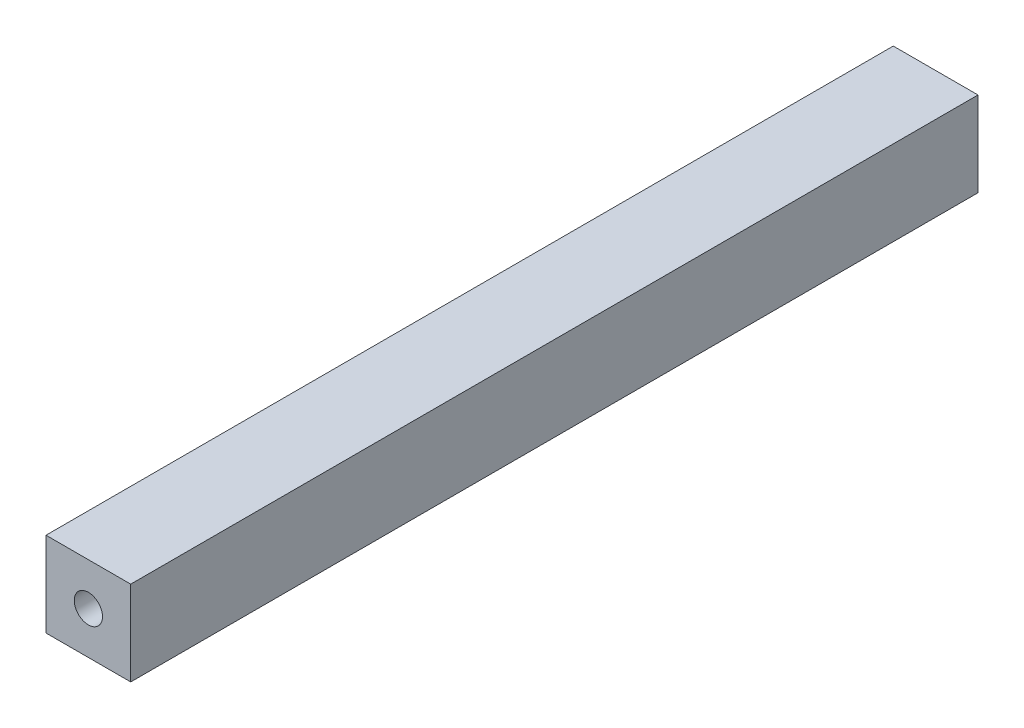
ISO-10303-21;
HEADER;
FILE_DESCRIPTION(('STEP AP214'),'2;1');
FILE_NAME('part.step','',(''),(''),'','','');
FILE_SCHEMA(('AUTOMOTIVE_DESIGN { 1 0 10303 214 1 1 1 1 }'));
ENDSEC;
DATA;
#1=APPLICATION_CONTEXT('core data for automotive mechanical design processes');
#2=APPLICATION_PROTOCOL_DEFINITION('international standard','automotive_design',2000,#1);
#3=PRODUCT_CONTEXT('',#1,'mechanical');
#4=PRODUCT('Part','Part','',(#3));
#5=PRODUCT_RELATED_PRODUCT_CATEGORY('part','',(#4));
#6=PRODUCT_DEFINITION_FORMATION('','',#4);
#7=PRODUCT_DEFINITION_CONTEXT('part definition',#1,'design');
#8=PRODUCT_DEFINITION('design','',#6,#7);
#9=PRODUCT_DEFINITION_SHAPE('','',#8);
#10=(LENGTH_UNIT() NAMED_UNIT(*) SI_UNIT(.MILLI.,.METRE.));
#11=(NAMED_UNIT(*) PLANE_ANGLE_UNIT() SI_UNIT($,.RADIAN.));
#12=(NAMED_UNIT(*) SI_UNIT($,.STERADIAN.) SOLID_ANGLE_UNIT());
#13=UNCERTAINTY_MEASURE_WITH_UNIT(LENGTH_MEASURE(1.E-05),#10,'distance_accuracy_value','');
#14=(GEOMETRIC_REPRESENTATION_CONTEXT(3) GLOBAL_UNCERTAINTY_ASSIGNED_CONTEXT((#13)) GLOBAL_UNIT_ASSIGNED_CONTEXT((#10,
#11,#12)) REPRESENTATION_CONTEXT('',''));
#15=CARTESIAN_POINT('',(0.,0.,0.));
#16=DIRECTION('',(0.,0.,1.));
#17=DIRECTION('',(1.,0.,0.));
#18=AXIS2_PLACEMENT_3D('',#15,#16,#17);
#19=CARTESIAN_POINT('',(-4.5,0.,90.));
#20=DIRECTION('',(-1.,0.,0.));
#21=DIRECTION('',(0.,0.,1.));
#22=AXIS2_PLACEMENT_3D('',#19,#20,#21);
#23=PLANE('',#22);
#24=DIRECTION('',(0.,1.,0.));
#25=VECTOR('',#24,1.);
#26=CARTESIAN_POINT('',(-4.5,0.,0.));
#27=LINE('',#26,#25);
#28=CARTESIAN_POINT('',(-4.5,-4.5,0.));
#29=VERTEX_POINT('',#28);
#30=CARTESIAN_POINT('',(-4.5,4.5,0.));
#31=VERTEX_POINT('',#30);
#32=EDGE_CURVE('E106',#29,#31,#27,.T.);
#33=ORIENTED_EDGE('',*,*,#32,.F.);
#34=DIRECTION('',(0.,0.,-1.));
#35=VECTOR('',#34,1.);
#36=CARTESIAN_POINT('',(-4.5,-4.5,90.));
#37=LINE('',#36,#35);
#38=CARTESIAN_POINT('',(-4.5,-4.5,90.));
#39=VERTEX_POINT('',#38);
#40=EDGE_CURVE('E11',#39,#29,#37,.T.);
#41=ORIENTED_EDGE('',*,*,#40,.F.);
#42=DIRECTION('',(0.,1.,0.));
#43=VECTOR('',#42,1.);
#44=CARTESIAN_POINT('',(-4.5,0.,90.));
#45=LINE('',#44,#43);
#46=CARTESIAN_POINT('',(-4.5,4.5,90.));
#47=VERTEX_POINT('',#46);
#48=EDGE_CURVE('E90',#39,#47,#45,.T.);
#49=ORIENTED_EDGE('',*,*,#48,.T.);
#50=DIRECTION('',(0.,0.,-1.));
#51=VECTOR('',#50,1.);
#52=CARTESIAN_POINT('',(-4.5,4.5,90.));
#53=LINE('',#52,#51);
#54=EDGE_CURVE('E52',#47,#31,#53,.T.);
#55=ORIENTED_EDGE('',*,*,#54,.T.);
#56=EDGE_LOOP('',(#33,#41,#49,#55));
#57=FACE_BOUND('',#56,.T.);
#58=ADVANCED_FACE('F35',(#57),#23,.T.);
#59=CARTESIAN_POINT('',(0.,-4.5,90.));
#60=DIRECTION('',(0.,1.,0.));
#61=DIRECTION('',(0.,0.,1.));
#62=AXIS2_PLACEMENT_3D('',#59,#60,#61);
#63=PLANE('',#62);
#64=DIRECTION('',(1.,0.,0.));
#65=VECTOR('',#64,1.);
#66=CARTESIAN_POINT('',(0.,-4.5,0.));
#67=LINE('',#66,#65);
#68=CARTESIAN_POINT('',(4.5,-4.5,0.));
#69=VERTEX_POINT('',#68);
#70=EDGE_CURVE('E95',#29,#69,#67,.T.);
#71=ORIENTED_EDGE('',*,*,#70,.T.);
#72=DIRECTION('',(0.,0.,-1.));
#73=VECTOR('',#72,1.);
#74=CARTESIAN_POINT('',(4.5,-4.5,90.));
#75=LINE('',#74,#73);
#76=CARTESIAN_POINT('',(4.5,-4.5,90.));
#77=VERTEX_POINT('',#76);
#78=EDGE_CURVE('E44',#77,#69,#75,.T.);
#79=ORIENTED_EDGE('',*,*,#78,.F.);
#80=DIRECTION('',(1.,0.,0.));
#81=VECTOR('',#80,1.);
#82=CARTESIAN_POINT('',(0.,-4.5,90.));
#83=LINE('',#82,#81);
#84=EDGE_CURVE('E86',#39,#77,#83,.T.);
#85=ORIENTED_EDGE('',*,*,#84,.F.);
#86=ORIENTED_EDGE('',*,*,#40,.T.);
#87=EDGE_LOOP('',(#71,#79,#85,#86));
#88=FACE_BOUND('',#87,.T.);
#89=ADVANCED_FACE('F93',(#88),#63,.F.);
#90=CARTESIAN_POINT('',(4.5,0.,90.));
#91=DIRECTION('',(-1.,0.,0.));
#92=DIRECTION('',(0.,0.,1.));
#93=AXIS2_PLACEMENT_3D('',#90,#91,#92);
#94=PLANE('',#93);
#95=DIRECTION('',(0.,1.,0.));
#96=VECTOR('',#95,1.);
#97=CARTESIAN_POINT('',(4.5,0.,0.));
#98=LINE('',#97,#96);
#99=CARTESIAN_POINT('',(4.5,4.5,0.));
#100=VERTEX_POINT('',#99);
#101=EDGE_CURVE('E103',#69,#100,#98,.T.);
#102=ORIENTED_EDGE('',*,*,#101,.T.);
#103=DIRECTION('',(0.,0.,-1.));
#104=VECTOR('',#103,1.);
#105=CARTESIAN_POINT('',(4.5,4.5,90.));
#106=LINE('',#105,#104);
#107=CARTESIAN_POINT('',(4.5,4.5,90.));
#108=VERTEX_POINT('',#107);
#109=EDGE_CURVE('E66',#108,#100,#106,.T.);
#110=ORIENTED_EDGE('',*,*,#109,.F.);
#111=DIRECTION('',(0.,1.,0.));
#112=VECTOR('',#111,1.);
#113=CARTESIAN_POINT('',(4.5,0.,90.));
#114=LINE('',#113,#112);
#115=EDGE_CURVE('E78',#77,#108,#114,.T.);
#116=ORIENTED_EDGE('',*,*,#115,.F.);
#117=ORIENTED_EDGE('',*,*,#78,.T.);
#118=EDGE_LOOP('',(#102,#110,#116,#117));
#119=FACE_BOUND('',#118,.T.);
#120=ADVANCED_FACE('F80',(#119),#94,.F.);
#121=CARTESIAN_POINT('',(0.,0.,90.));
#122=DIRECTION('',(0.,0.,-1.));
#123=DIRECTION('',(-1.,0.,0.));
#124=AXIS2_PLACEMENT_3D('',#121,#122,#123);
#125=CYLINDRICAL_SURFACE('',#124,1.5);
#126=CARTESIAN_POINT('',(0.,0.,90.));
#127=DIRECTION('',(0.,0.,1.));
#128=DIRECTION('',(1.,0.,0.));
#129=AXIS2_PLACEMENT_3D('',#126,#127,#128);
#130=CIRCLE('',#129,1.5);
#131=CARTESIAN_POINT('',(-1.5,0.,90.));
#132=VERTEX_POINT('',#131);
#133=EDGE_CURVE('E102',#132,#132,#130,.T.);
#134=CARTESIAN_POINT('',(0.,0.,0.));
#135=DIRECTION('',(0.,0.,1.));
#136=DIRECTION('',(1.,0.,0.));
#137=AXIS2_PLACEMENT_3D('',#134,#135,#136);
#138=CIRCLE('',#137,1.5);
#139=CARTESIAN_POINT('',(-1.5,0.,0.));
#140=VERTEX_POINT('',#139);
#141=EDGE_CURVE('E108',#140,#140,#138,.T.);
#142=CARTESIAN_POINT('',(-1.5,0.,90.));
#143=CARTESIAN_POINT('',(-1.5,0.,89.0625));
#144=CARTESIAN_POINT('',(-1.5,0.,88.125));
#145=CARTESIAN_POINT('',(-1.5,0.,86.25));
#146=CARTESIAN_POINT('',(-1.5,0.,85.3125));
#147=CARTESIAN_POINT('',(-1.5,0.,83.4375));
#148=CARTESIAN_POINT('',(-1.5,0.,82.5));
#149=CARTESIAN_POINT('',(-1.5,0.,80.625));
#150=CARTESIAN_POINT('',(-1.5,0.,79.6875));
#151=CARTESIAN_POINT('',(-1.5,0.,77.8125));
#152=CARTESIAN_POINT('',(-1.5,0.,76.875));
#153=CARTESIAN_POINT('',(-1.5,0.,75.));
#154=CARTESIAN_POINT('',(-1.5,0.,74.0625));
#155=CARTESIAN_POINT('',(-1.5,0.,72.1875));
#156=CARTESIAN_POINT('',(-1.5,0.,71.25));
#157=CARTESIAN_POINT('',(-1.5,0.,69.375));
#158=CARTESIAN_POINT('',(-1.5,0.,68.4375));
#159=CARTESIAN_POINT('',(-1.5,0.,66.5625));
#160=CARTESIAN_POINT('',(-1.5,0.,65.625));
#161=CARTESIAN_POINT('',(-1.5,0.,63.75));
#162=CARTESIAN_POINT('',(-1.5,0.,62.8125));
#163=CARTESIAN_POINT('',(-1.5,0.,60.9375));
#164=CARTESIAN_POINT('',(-1.5,0.,60.));
#165=CARTESIAN_POINT('',(-1.5,0.,58.125));
#166=CARTESIAN_POINT('',(-1.5,0.,57.1875));
#167=CARTESIAN_POINT('',(-1.5,0.,55.3125));
#168=CARTESIAN_POINT('',(-1.5,0.,54.375));
#169=CARTESIAN_POINT('',(-1.5,0.,52.5));
#170=CARTESIAN_POINT('',(-1.5,0.,51.5625));
#171=CARTESIAN_POINT('',(-1.5,0.,49.6875));
#172=CARTESIAN_POINT('',(-1.5,0.,48.75));
#173=CARTESIAN_POINT('',(-1.5,0.,46.875));
#174=CARTESIAN_POINT('',(-1.5,0.,45.9375));
#175=CARTESIAN_POINT('',(-1.5,0.,44.0625));
#176=CARTESIAN_POINT('',(-1.5,0.,43.125));
#177=CARTESIAN_POINT('',(-1.5,0.,41.25));
#178=CARTESIAN_POINT('',(-1.5,0.,40.3125));
#179=CARTESIAN_POINT('',(-1.5,0.,38.4375));
#180=CARTESIAN_POINT('',(-1.5,0.,37.5));
#181=CARTESIAN_POINT('',(-1.5,0.,35.625));
#182=CARTESIAN_POINT('',(-1.5,0.,34.6875));
#183=CARTESIAN_POINT('',(-1.5,0.,32.8125));
#184=CARTESIAN_POINT('',(-1.5,0.,31.875));
#185=CARTESIAN_POINT('',(-1.5,0.,30.));
#186=CARTESIAN_POINT('',(-1.5,0.,29.0625));
#187=CARTESIAN_POINT('',(-1.5,0.,27.1875));
#188=CARTESIAN_POINT('',(-1.5,0.,26.25));
#189=CARTESIAN_POINT('',(-1.5,0.,24.375));
#190=CARTESIAN_POINT('',(-1.5,0.,23.4375));
#191=CARTESIAN_POINT('',(-1.5,0.,21.5625));
#192=CARTESIAN_POINT('',(-1.5,0.,20.625));
#193=CARTESIAN_POINT('',(-1.5,0.,18.75));
#194=CARTESIAN_POINT('',(-1.5,0.,17.8125));
#195=CARTESIAN_POINT('',(-1.5,0.,15.9375));
#196=CARTESIAN_POINT('',(-1.5,0.,15.));
#197=CARTESIAN_POINT('',(-1.5,0.,13.125));
#198=CARTESIAN_POINT('',(-1.5,0.,12.1875));
#199=CARTESIAN_POINT('',(-1.5,0.,10.3125));
#200=CARTESIAN_POINT('',(-1.5,0.,9.37499999999999));
#201=CARTESIAN_POINT('',(-1.5,0.,7.49999999999999));
#202=CARTESIAN_POINT('',(-1.5,0.,6.56249999999999));
#203=CARTESIAN_POINT('',(-1.5,0.,4.68749999999999));
#204=CARTESIAN_POINT('',(-1.5,0.,3.74999999999998));
#205=CARTESIAN_POINT('',(-1.5,0.,1.87499999999998));
#206=CARTESIAN_POINT('',(-1.5,0.,0.937499999999986));
#207=CARTESIAN_POINT('',(-1.5,0.,0.));
#208=B_SPLINE_CURVE_WITH_KNOTS('',3,(#142,#143,#144,#145,#146,#147,#148,#149,#150,#151,#152,
#153,#154,#155,#156,#157,#158,#159,#160,#161,#162,#163,#164,#165,#166,#167,#168,#169,#170,#171,
#172,#173,#174,#175,#176,#177,#178,#179,#180,#181,#182,#183,#184,#185,#186,#187,#188,#189,#190,
#191,#192,#193,#194,#195,#196,#197,#198,#199,#200,#201,#202,#203,#204,#205,#206,#207),
.UNSPECIFIED.,.F.,.F.,(4,2,2,2,2,2,2,2,2,2,2,2,2,2,2,2,2,2,2,2,2,2,2,2,2,2,2,2,2,2,2,2,4),(0.,
2.81250000000001,5.62500000000001,8.43750000000001,11.25,14.0625,16.875,19.6875,22.5,25.3125,
28.125,30.9375,33.75,36.5625,39.375,42.1875,45.,47.8125,50.625,53.4375,56.25,59.0625,61.875,
64.6875,67.5,70.3125,73.125,75.9375,78.75,81.5625,84.375,87.1875,90.),.UNSPECIFIED.);
#209=EDGE_CURVE('BSEAM37',#132,#140,#208,.T.);
#210=ORIENTED_EDGE('',*,*,#133,.T.);
#211=ORIENTED_EDGE('',*,*,#141,.F.);
#212=ORIENTED_EDGE('',*,*,#209,.T.);
#213=ORIENTED_EDGE('',*,*,#209,.F.);
#214=EDGE_LOOP('',(#210,#212,#211,#213));
#215=FACE_BOUND('',#214,.T.);
#216=ADVANCED_FACE('F37',(#215),#125,.F.);
#217=CARTESIAN_POINT('',(0.,4.5,90.));
#218=DIRECTION('',(0.,1.,0.));
#219=DIRECTION('',(0.,0.,1.));
#220=AXIS2_PLACEMENT_3D('',#217,#218,#219);
#221=PLANE('',#220);
#222=DIRECTION('',(1.,0.,0.));
#223=VECTOR('',#222,1.);
#224=CARTESIAN_POINT('',(0.,4.5,0.));
#225=LINE('',#224,#223);
#226=EDGE_CURVE('E99',#31,#100,#225,.T.);
#227=ORIENTED_EDGE('',*,*,#226,.F.);
#228=ORIENTED_EDGE('',*,*,#54,.F.);
#229=DIRECTION('',(1.,0.,0.));
#230=VECTOR('',#229,1.);
#231=CARTESIAN_POINT('',(0.,4.5,90.));
#232=LINE('',#231,#230);
#233=EDGE_CURVE('E85',#47,#108,#232,.T.);
#234=ORIENTED_EDGE('',*,*,#233,.T.);
#235=ORIENTED_EDGE('',*,*,#109,.T.);
#236=EDGE_LOOP('',(#227,#228,#234,#235));
#237=FACE_BOUND('',#236,.T.);
#238=ADVANCED_FACE('F120',(#237),#221,.T.);
#239=CARTESIAN_POINT('',(0.,0.,90.));
#240=DIRECTION('',(0.,0.,1.));
#241=DIRECTION('',(1.,0.,0.));
#242=AXIS2_PLACEMENT_3D('',#239,#240,#241);
#243=PLANE('',#242);
#244=ORIENTED_EDGE('',*,*,#133,.F.);
#245=EDGE_LOOP('',(#244));
#246=FACE_BOUND('',#245,.T.);
#247=ORIENTED_EDGE('',*,*,#48,.F.);
#248=ORIENTED_EDGE('',*,*,#84,.T.);
#249=ORIENTED_EDGE('',*,*,#115,.T.);
#250=ORIENTED_EDGE('',*,*,#233,.F.);
#251=EDGE_LOOP('',(#247,#248,#249,#250));
#252=FACE_BOUND('',#251,.T.);
#253=ADVANCED_FACE('F89',(#246,#252),#243,.T.);
#254=CARTESIAN_POINT('',(0.,0.,0.));
#255=DIRECTION('',(0.,0.,1.));
#256=DIRECTION('',(1.,0.,0.));
#257=AXIS2_PLACEMENT_3D('',#254,#255,#256);
#258=PLANE('',#257);
#259=ORIENTED_EDGE('',*,*,#141,.T.);
#260=EDGE_LOOP('',(#259));
#261=FACE_BOUND('',#260,.T.);
#262=ORIENTED_EDGE('',*,*,#32,.T.);
#263=ORIENTED_EDGE('',*,*,#226,.T.);
#264=ORIENTED_EDGE('',*,*,#101,.F.);
#265=ORIENTED_EDGE('',*,*,#70,.F.);
#266=EDGE_LOOP('',(#262,#263,#264,#265));
#267=FACE_BOUND('',#266,.T.);
#268=ADVANCED_FACE('F119',(#261,#267),#258,.F.);
#269=CLOSED_SHELL('',(#58,#89,#120,#216,#238,#253,#268));
#270=MANIFOLD_SOLID_BREP('B2',#269);
#271=ADVANCED_BREP_SHAPE_REPRESENTATION('',(#18,#270),#14);
#272=SHAPE_DEFINITION_REPRESENTATION(#9,#271);
ENDSEC;
END-ISO-10303-21;
